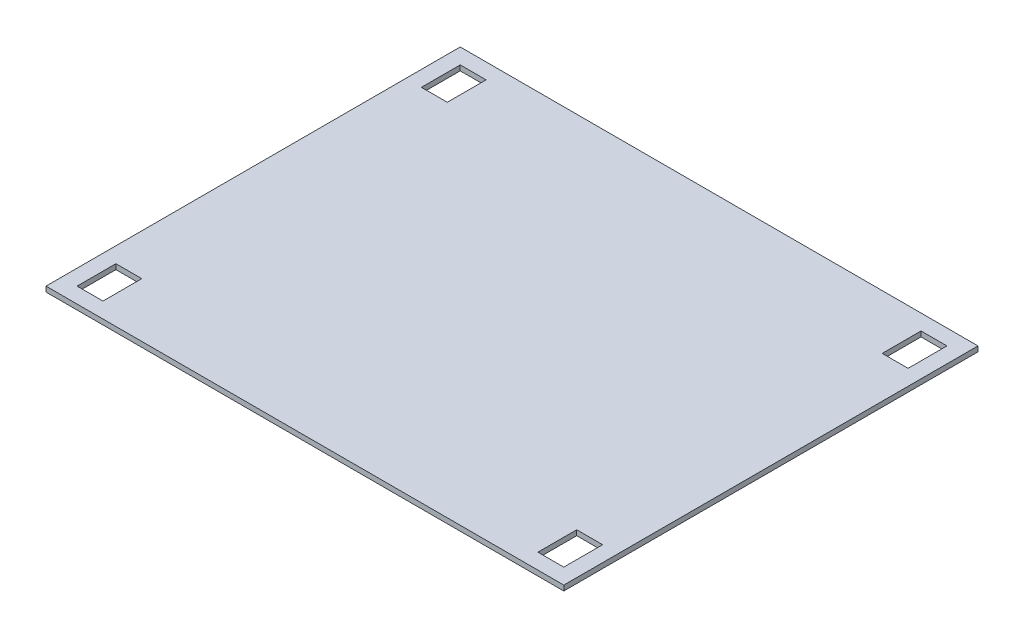
ISO-10303-21;
HEADER;
FILE_DESCRIPTION(('STEP AP214'),'2;1');
FILE_NAME('part.step','',(''),(''),'','','');
FILE_SCHEMA(('AUTOMOTIVE_DESIGN { 1 0 10303 214 1 1 1 1 }'));
ENDSEC;
DATA;
#1=APPLICATION_CONTEXT('core data for automotive mechanical design processes');
#2=APPLICATION_PROTOCOL_DEFINITION('international standard','automotive_design',2000,#1);
#3=PRODUCT_CONTEXT('',#1,'mechanical');
#4=PRODUCT('Part','Part','',(#3));
#5=PRODUCT_RELATED_PRODUCT_CATEGORY('part','',(#4));
#6=PRODUCT_DEFINITION_FORMATION('','',#4);
#7=PRODUCT_DEFINITION_CONTEXT('part definition',#1,'design');
#8=PRODUCT_DEFINITION('design','',#6,#7);
#9=PRODUCT_DEFINITION_SHAPE('','',#8);
#10=(LENGTH_UNIT() NAMED_UNIT(*) SI_UNIT(.MILLI.,.METRE.));
#11=(NAMED_UNIT(*) PLANE_ANGLE_UNIT() SI_UNIT($,.RADIAN.));
#12=(NAMED_UNIT(*) SI_UNIT($,.STERADIAN.) SOLID_ANGLE_UNIT());
#13=UNCERTAINTY_MEASURE_WITH_UNIT(LENGTH_MEASURE(1.E-05),#10,'distance_accuracy_value','');
#14=(GEOMETRIC_REPRESENTATION_CONTEXT(3) GLOBAL_UNCERTAINTY_ASSIGNED_CONTEXT((#13)) GLOBAL_UNIT_ASSIGNED_CONTEXT((#10,
#11,#12)) REPRESENTATION_CONTEXT('',''));
#15=CARTESIAN_POINT('',(0.,0.,0.));
#16=DIRECTION('',(0.,0.,1.));
#17=DIRECTION('',(1.,0.,0.));
#18=AXIS2_PLACEMENT_3D('',#15,#16,#17);
#19=CARTESIAN_POINT('',(-63.5,1.27,-50.8));
#20=DIRECTION('',(1.,0.,0.));
#21=DIRECTION('',(0.,0.,-1.));
#22=AXIS2_PLACEMENT_3D('',#19,#20,#21);
#23=PLANE('',#22);
#24=DIRECTION('',(0.,0.,1.));
#25=VECTOR('',#24,1.);
#26=CARTESIAN_POINT('',(-63.5,0.,-50.8));
#27=LINE('',#26,#25);
#28=CARTESIAN_POINT('',(-63.5,0.,-50.8));
#29=VERTEX_POINT('',#28);
#30=CARTESIAN_POINT('',(-63.5,0.,50.8));
#31=VERTEX_POINT('',#30);
#32=EDGE_CURVE('E356',#29,#31,#27,.T.);
#33=ORIENTED_EDGE('',*,*,#32,.T.);
#34=DIRECTION('',(0.,-1.,0.));
#35=VECTOR('',#34,1.);
#36=CARTESIAN_POINT('',(-63.5,1.27,50.8));
#37=LINE('',#36,#35);
#38=CARTESIAN_POINT('',(-63.5,1.27,50.8));
#39=VERTEX_POINT('',#38);
#40=EDGE_CURVE('E11',#39,#31,#37,.T.);
#41=ORIENTED_EDGE('',*,*,#40,.F.);
#42=DIRECTION('',(0.,0.,1.));
#43=VECTOR('',#42,1.);
#44=CARTESIAN_POINT('',(-63.5,1.27,-50.8));
#45=LINE('',#44,#43);
#46=CARTESIAN_POINT('',(-63.5,1.27,-50.8));
#47=VERTEX_POINT('',#46);
#48=EDGE_CURVE('E357',#47,#39,#45,.T.);
#49=ORIENTED_EDGE('',*,*,#48,.F.);
#50=DIRECTION('',(0.,-1.,0.));
#51=VECTOR('',#50,1.);
#52=CARTESIAN_POINT('',(-63.5,1.27,-50.8));
#53=LINE('',#52,#51);
#54=EDGE_CURVE('E371',#47,#29,#53,.T.);
#55=ORIENTED_EDGE('',*,*,#54,.T.);
#56=EDGE_LOOP('',(#33,#41,#49,#55));
#57=FACE_BOUND('',#56,.T.);
#58=ADVANCED_FACE('F40',(#57),#23,.F.);
#59=CARTESIAN_POINT('',(-63.5,1.27,50.8));
#60=DIRECTION('',(0.,0.,-1.));
#61=DIRECTION('',(-1.,0.,0.));
#62=AXIS2_PLACEMENT_3D('',#59,#60,#61);
#63=PLANE('',#62);
#64=DIRECTION('',(1.,0.,0.));
#65=VECTOR('',#64,1.);
#66=CARTESIAN_POINT('',(-63.5,0.,50.8));
#67=LINE('',#66,#65);
#68=CARTESIAN_POINT('',(63.5,0.,50.8));
#69=VERTEX_POINT('',#68);
#70=EDGE_CURVE('E375',#31,#69,#67,.T.);
#71=ORIENTED_EDGE('',*,*,#70,.T.);
#72=DIRECTION('',(0.,-1.,0.));
#73=VECTOR('',#72,1.);
#74=CARTESIAN_POINT('',(63.5,1.27,50.8));
#75=LINE('',#74,#73);
#76=CARTESIAN_POINT('',(63.5,1.27,50.8));
#77=VERTEX_POINT('',#76);
#78=EDGE_CURVE('E48',#77,#69,#75,.T.);
#79=ORIENTED_EDGE('',*,*,#78,.F.);
#80=DIRECTION('',(1.,0.,0.));
#81=VECTOR('',#80,1.);
#82=CARTESIAN_POINT('',(-63.5,1.27,50.8));
#83=LINE('',#82,#81);
#84=EDGE_CURVE('E361',#39,#77,#83,.T.);
#85=ORIENTED_EDGE('',*,*,#84,.F.);
#86=ORIENTED_EDGE('',*,*,#40,.T.);
#87=EDGE_LOOP('',(#71,#79,#85,#86));
#88=FACE_BOUND('',#87,.T.);
#89=ADVANCED_FACE('F410',(#88),#63,.F.);
#90=CARTESIAN_POINT('',(63.5,1.27,-50.8));
#91=DIRECTION('',(-1.,0.,0.));
#92=DIRECTION('',(0.,0.,1.));
#93=AXIS2_PLACEMENT_3D('',#90,#91,#92);
#94=PLANE('',#93);
#95=DIRECTION('',(0.,0.,-1.));
#96=VECTOR('',#95,1.);
#97=CARTESIAN_POINT('',(63.5,0.,-50.8));
#98=LINE('',#97,#96);
#99=CARTESIAN_POINT('',(63.5,0.,-50.8));
#100=VERTEX_POINT('',#99);
#101=EDGE_CURVE('E378',#69,#100,#98,.T.);
#102=ORIENTED_EDGE('',*,*,#101,.T.);
#103=DIRECTION('',(0.,-1.,0.));
#104=VECTOR('',#103,1.);
#105=CARTESIAN_POINT('',(63.5,1.27,-50.8));
#106=LINE('',#105,#104);
#107=CARTESIAN_POINT('',(63.5,1.27,-50.8));
#108=VERTEX_POINT('',#107);
#109=EDGE_CURVE('E386',#108,#100,#106,.T.);
#110=ORIENTED_EDGE('',*,*,#109,.F.);
#111=DIRECTION('',(0.,0.,-1.));
#112=VECTOR('',#111,1.);
#113=CARTESIAN_POINT('',(63.5,1.27,-50.8));
#114=LINE('',#113,#112);
#115=EDGE_CURVE('E365',#77,#108,#114,.T.);
#116=ORIENTED_EDGE('',*,*,#115,.F.);
#117=ORIENTED_EDGE('',*,*,#78,.T.);
#118=EDGE_LOOP('',(#102,#110,#116,#117));
#119=FACE_BOUND('',#118,.T.);
#120=ADVANCED_FACE('F395',(#119),#94,.F.);
#121=CARTESIAN_POINT('',(-63.5,1.27,-50.8));
#122=DIRECTION('',(0.,0.,1.));
#123=DIRECTION('',(1.,0.,0.));
#124=AXIS2_PLACEMENT_3D('',#121,#122,#123);
#125=PLANE('',#124);
#126=DIRECTION('',(-1.,0.,0.));
#127=VECTOR('',#126,1.);
#128=CARTESIAN_POINT('',(-63.5,0.,-50.8));
#129=LINE('',#128,#127);
#130=EDGE_CURVE('E362',#100,#29,#129,.T.);
#131=ORIENTED_EDGE('',*,*,#130,.T.);
#132=ORIENTED_EDGE('',*,*,#54,.F.);
#133=DIRECTION('',(-1.,0.,0.));
#134=VECTOR('',#133,1.);
#135=CARTESIAN_POINT('',(-63.5,1.27,-50.8));
#136=LINE('',#135,#134);
#137=EDGE_CURVE('E368',#108,#47,#136,.T.);
#138=ORIENTED_EDGE('',*,*,#137,.F.);
#139=ORIENTED_EDGE('',*,*,#109,.T.);
#140=EDGE_LOOP('',(#131,#132,#138,#139));
#141=FACE_BOUND('',#140,.T.);
#142=ADVANCED_FACE('F403',(#141),#125,.F.);
#143=CARTESIAN_POINT('',(0.,1.27,0.));
#144=DIRECTION('',(0.,1.,0.));
#145=DIRECTION('',(0.,0.,1.));
#146=AXIS2_PLACEMENT_3D('',#143,#144,#145);
#147=PLANE('',#146);
#148=DIRECTION('',(1.,0.,0.));
#149=VECTOR('',#148,1.);
#150=CARTESIAN_POINT('',(-59.69,1.27,46.99));
#151=LINE('',#150,#149);
#152=CARTESIAN_POINT('',(-59.69,1.27,46.99));
#153=VERTEX_POINT('',#152);
#154=CARTESIAN_POINT('',(-53.34,1.27,46.99));
#155=VERTEX_POINT('',#154);
#156=EDGE_CURVE('E55',#153,#155,#151,.T.);
#157=ORIENTED_EDGE('',*,*,#156,.F.);
#158=DIRECTION('',(0.,0.,1.));
#159=VECTOR('',#158,1.);
#160=CARTESIAN_POINT('',(-59.69,1.27,46.99));
#161=LINE('',#160,#159);
#162=CARTESIAN_POINT('',(-59.69,1.27,37.465));
#163=VERTEX_POINT('',#162);
#164=EDGE_CURVE('E295',#163,#153,#161,.T.);
#165=ORIENTED_EDGE('',*,*,#164,.F.);
#166=DIRECTION('',(-1.,0.,0.));
#167=VECTOR('',#166,1.);
#168=CARTESIAN_POINT('',(-59.69,1.27,37.465));
#169=LINE('',#168,#167);
#170=CARTESIAN_POINT('',(-53.34,1.27,37.465));
#171=VERTEX_POINT('',#170);
#172=EDGE_CURVE('E291',#171,#163,#169,.T.);
#173=ORIENTED_EDGE('',*,*,#172,.F.);
#174=DIRECTION('',(0.,0.,-1.));
#175=VECTOR('',#174,1.);
#176=CARTESIAN_POINT('',(-53.34,1.27,46.99));
#177=LINE('',#176,#175);
#178=EDGE_CURVE('E287',#155,#171,#177,.T.);
#179=ORIENTED_EDGE('',*,*,#178,.F.);
#180=EDGE_LOOP('',(#157,#165,#173,#179));
#181=FACE_BOUND('',#180,.T.);
#182=DIRECTION('',(0.,0.,-1.));
#183=VECTOR('',#182,1.);
#184=CARTESIAN_POINT('',(59.69,1.27,46.99));
#185=LINE('',#184,#183);
#186=CARTESIAN_POINT('',(59.69,1.27,46.99));
#187=VERTEX_POINT('',#186);
#188=CARTESIAN_POINT('',(59.69,1.27,37.465));
#189=VERTEX_POINT('',#188);
#190=EDGE_CURVE('E63',#187,#189,#185,.T.);
#191=ORIENTED_EDGE('',*,*,#190,.F.);
#192=DIRECTION('',(1.,0.,0.));
#193=VECTOR('',#192,1.);
#194=CARTESIAN_POINT('',(59.69,1.27,46.99));
#195=LINE('',#194,#193);
#196=CARTESIAN_POINT('',(53.34,1.27,46.99));
#197=VERTEX_POINT('',#196);
#198=EDGE_CURVE('E254',#197,#187,#195,.T.);
#199=ORIENTED_EDGE('',*,*,#198,.F.);
#200=DIRECTION('',(0.,0.,1.));
#201=VECTOR('',#200,1.);
#202=CARTESIAN_POINT('',(53.34,1.27,46.99));
#203=LINE('',#202,#201);
#204=CARTESIAN_POINT('',(53.34,1.27,37.465));
#205=VERTEX_POINT('',#204);
#206=EDGE_CURVE('E250',#205,#197,#203,.T.);
#207=ORIENTED_EDGE('',*,*,#206,.F.);
#208=DIRECTION('',(-1.,0.,0.));
#209=VECTOR('',#208,1.);
#210=CARTESIAN_POINT('',(59.69,1.27,37.465));
#211=LINE('',#210,#209);
#212=EDGE_CURVE('E246',#189,#205,#211,.T.);
#213=ORIENTED_EDGE('',*,*,#212,.F.);
#214=EDGE_LOOP('',(#191,#199,#207,#213));
#215=FACE_BOUND('',#214,.T.);
#216=DIRECTION('',(-1.,0.,0.));
#217=VECTOR('',#216,1.);
#218=CARTESIAN_POINT('',(59.69,1.27,-46.99));
#219=LINE('',#218,#217);
#220=CARTESIAN_POINT('',(59.69,1.27,-46.99));
#221=VERTEX_POINT('',#220);
#222=CARTESIAN_POINT('',(53.34,1.27,-46.99));
#223=VERTEX_POINT('',#222);
#224=EDGE_CURVE('E184',#221,#223,#219,.T.);
#225=ORIENTED_EDGE('',*,*,#224,.F.);
#226=DIRECTION('',(0.,0.,-1.));
#227=VECTOR('',#226,1.);
#228=CARTESIAN_POINT('',(59.69,1.27,-46.99));
#229=LINE('',#228,#227);
#230=CARTESIAN_POINT('',(59.69,1.27,-37.465));
#231=VERTEX_POINT('',#230);
#232=EDGE_CURVE('E190',#231,#221,#229,.T.);
#233=ORIENTED_EDGE('',*,*,#232,.F.);
#234=DIRECTION('',(1.,0.,0.));
#235=VECTOR('',#234,1.);
#236=CARTESIAN_POINT('',(59.69,1.27,-37.465));
#237=LINE('',#236,#235);
#238=CARTESIAN_POINT('',(53.34,1.27,-37.465));
#239=VERTEX_POINT('',#238);
#240=EDGE_CURVE('E218',#239,#231,#237,.T.);
#241=ORIENTED_EDGE('',*,*,#240,.F.);
#242=DIRECTION('',(0.,0.,1.));
#243=VECTOR('',#242,1.);
#244=CARTESIAN_POINT('',(53.34,1.27,-46.99));
#245=LINE('',#244,#243);
#246=EDGE_CURVE('E210',#223,#239,#245,.T.);
#247=ORIENTED_EDGE('',*,*,#246,.F.);
#248=EDGE_LOOP('',(#225,#233,#241,#247));
#249=FACE_BOUND('',#248,.T.);
#250=DIRECTION('',(0.,0.,1.));
#251=VECTOR('',#250,1.);
#252=CARTESIAN_POINT('',(-59.69,1.27,-46.99));
#253=LINE('',#252,#251);
#254=CARTESIAN_POINT('',(-59.69,1.27,-46.99));
#255=VERTEX_POINT('',#254);
#256=CARTESIAN_POINT('',(-59.69,1.27,-37.465));
#257=VERTEX_POINT('',#256);
#258=EDGE_CURVE('E324',#255,#257,#253,.T.);
#259=ORIENTED_EDGE('',*,*,#258,.F.);
#260=DIRECTION('',(-1.,0.,0.));
#261=VECTOR('',#260,1.);
#262=CARTESIAN_POINT('',(-59.69,1.27,-46.99));
#263=LINE('',#262,#261);
#264=CARTESIAN_POINT('',(-53.34,1.27,-46.99));
#265=VERTEX_POINT('',#264);
#266=EDGE_CURVE('E335',#265,#255,#263,.T.);
#267=ORIENTED_EDGE('',*,*,#266,.F.);
#268=DIRECTION('',(0.,0.,-1.));
#269=VECTOR('',#268,1.);
#270=CARTESIAN_POINT('',(-53.34,1.27,-46.99));
#271=LINE('',#270,#269);
#272=CARTESIAN_POINT('',(-53.34,1.27,-37.465));
#273=VERTEX_POINT('',#272);
#274=EDGE_CURVE('E331',#273,#265,#271,.T.);
#275=ORIENTED_EDGE('',*,*,#274,.F.);
#276=DIRECTION('',(1.,0.,0.));
#277=VECTOR('',#276,1.);
#278=CARTESIAN_POINT('',(-59.69,1.27,-37.465));
#279=LINE('',#278,#277);
#280=EDGE_CURVE('E327',#257,#273,#279,.T.);
#281=ORIENTED_EDGE('',*,*,#280,.F.);
#282=EDGE_LOOP('',(#259,#267,#275,#281));
#283=FACE_BOUND('',#282,.T.);
#284=ORIENTED_EDGE('',*,*,#48,.T.);
#285=ORIENTED_EDGE('',*,*,#84,.T.);
#286=ORIENTED_EDGE('',*,*,#115,.T.);
#287=ORIENTED_EDGE('',*,*,#137,.T.);
#288=EDGE_LOOP('',(#284,#285,#286,#287));
#289=FACE_BOUND('',#288,.T.);
#290=ADVANCED_FACE('F409',(#181,#215,#249,#283,#289),#147,.T.);
#291=CARTESIAN_POINT('',(0.,0.,0.));
#292=DIRECTION('',(0.,1.,0.));
#293=DIRECTION('',(0.,0.,1.));
#294=AXIS2_PLACEMENT_3D('',#291,#292,#293);
#295=PLANE('',#294);
#296=DIRECTION('',(0.,0.,-1.));
#297=VECTOR('',#296,1.);
#298=CARTESIAN_POINT('',(-59.69,0.,46.99));
#299=LINE('',#298,#297);
#300=CARTESIAN_POINT('',(-59.69,0.,46.99));
#301=VERTEX_POINT('',#300);
#302=CARTESIAN_POINT('',(-59.69,0.,37.465));
#303=VERTEX_POINT('',#302);
#304=EDGE_CURVE('E277',#301,#303,#299,.T.);
#305=ORIENTED_EDGE('',*,*,#304,.F.);
#306=DIRECTION('',(-1.,0.,0.));
#307=VECTOR('',#306,1.);
#308=CARTESIAN_POINT('',(-59.69,0.,46.99));
#309=LINE('',#308,#307);
#310=CARTESIAN_POINT('',(-53.34,0.,46.99));
#311=VERTEX_POINT('',#310);
#312=EDGE_CURVE('E281',#311,#301,#309,.T.);
#313=ORIENTED_EDGE('',*,*,#312,.F.);
#314=DIRECTION('',(0.,0.,1.));
#315=VECTOR('',#314,1.);
#316=CARTESIAN_POINT('',(-53.34,0.,46.99));
#317=LINE('',#316,#315);
#318=CARTESIAN_POINT('',(-53.34,0.,37.465));
#319=VERTEX_POINT('',#318);
#320=EDGE_CURVE('E236',#319,#311,#317,.T.);
#321=ORIENTED_EDGE('',*,*,#320,.F.);
#322=DIRECTION('',(1.,0.,0.));
#323=VECTOR('',#322,1.);
#324=CARTESIAN_POINT('',(-59.69,0.,37.465));
#325=LINE('',#324,#323);
#326=EDGE_CURVE('E274',#303,#319,#325,.T.);
#327=ORIENTED_EDGE('',*,*,#326,.F.);
#328=EDGE_LOOP('',(#305,#313,#321,#327));
#329=FACE_BOUND('',#328,.T.);
#330=DIRECTION('',(-1.,0.,0.));
#331=VECTOR('',#330,1.);
#332=CARTESIAN_POINT('',(59.69,0.,46.99));
#333=LINE('',#332,#331);
#334=CARTESIAN_POINT('',(59.69,0.,46.99));
#335=VERTEX_POINT('',#334);
#336=CARTESIAN_POINT('',(53.34,0.,46.99));
#337=VERTEX_POINT('',#336);
#338=EDGE_CURVE('E235',#335,#337,#333,.T.);
#339=ORIENTED_EDGE('',*,*,#338,.F.);
#340=DIRECTION('',(0.,0.,1.));
#341=VECTOR('',#340,1.);
#342=CARTESIAN_POINT('',(59.69,0.,46.99));
#343=LINE('',#342,#341);
#344=CARTESIAN_POINT('',(59.69,0.,37.465));
#345=VERTEX_POINT('',#344);
#346=EDGE_CURVE('E240',#345,#335,#343,.T.);
#347=ORIENTED_EDGE('',*,*,#346,.F.);
#348=DIRECTION('',(1.,0.,0.));
#349=VECTOR('',#348,1.);
#350=CARTESIAN_POINT('',(59.69,0.,37.465));
#351=LINE('',#350,#349);
#352=CARTESIAN_POINT('',(53.34,0.,37.465));
#353=VERTEX_POINT('',#352);
#354=EDGE_CURVE('E262',#353,#345,#351,.T.);
#355=ORIENTED_EDGE('',*,*,#354,.F.);
#356=DIRECTION('',(0.,0.,-1.));
#357=VECTOR('',#356,1.);
#358=CARTESIAN_POINT('',(53.34,0.,46.99));
#359=LINE('',#358,#357);
#360=EDGE_CURVE('E232',#337,#353,#359,.T.);
#361=ORIENTED_EDGE('',*,*,#360,.F.);
#362=EDGE_LOOP('',(#339,#347,#355,#361));
#363=FACE_BOUND('',#362,.T.);
#364=DIRECTION('',(0.,0.,1.));
#365=VECTOR('',#364,1.);
#366=CARTESIAN_POINT('',(59.69,0.,-46.99));
#367=LINE('',#366,#365);
#368=CARTESIAN_POINT('',(59.69,0.,-46.99));
#369=VERTEX_POINT('',#368);
#370=CARTESIAN_POINT('',(59.69,0.,-37.465));
#371=VERTEX_POINT('',#370);
#372=EDGE_CURVE('E205',#369,#371,#367,.T.);
#373=ORIENTED_EDGE('',*,*,#372,.F.);
#374=DIRECTION('',(1.,0.,0.));
#375=VECTOR('',#374,1.);
#376=CARTESIAN_POINT('',(59.69,0.,-46.99));
#377=LINE('',#376,#375);
#378=CARTESIAN_POINT('',(53.34,0.,-46.99));
#379=VERTEX_POINT('',#378);
#380=EDGE_CURVE('E181',#379,#369,#377,.T.);
#381=ORIENTED_EDGE('',*,*,#380,.F.);
#382=DIRECTION('',(0.,0.,-1.));
#383=VECTOR('',#382,1.);
#384=CARTESIAN_POINT('',(53.34,0.,-46.99));
#385=LINE('',#384,#383);
#386=CARTESIAN_POINT('',(53.34,0.,-37.465));
#387=VERTEX_POINT('',#386);
#388=EDGE_CURVE('E194',#387,#379,#385,.T.);
#389=ORIENTED_EDGE('',*,*,#388,.F.);
#390=DIRECTION('',(-1.,0.,0.));
#391=VECTOR('',#390,1.);
#392=CARTESIAN_POINT('',(59.69,0.,-37.465));
#393=LINE('',#392,#391);
#394=EDGE_CURVE('E212',#371,#387,#393,.T.);
#395=ORIENTED_EDGE('',*,*,#394,.F.);
#396=EDGE_LOOP('',(#373,#381,#389,#395));
#397=FACE_BOUND('',#396,.T.);
#398=DIRECTION('',(1.,0.,0.));
#399=VECTOR('',#398,1.);
#400=CARTESIAN_POINT('',(-59.69,0.,-46.99));
#401=LINE('',#400,#399);
#402=CARTESIAN_POINT('',(-59.69,0.,-46.99));
#403=VERTEX_POINT('',#402);
#404=CARTESIAN_POINT('',(-53.34,0.,-46.99));
#405=VERTEX_POINT('',#404);
#406=EDGE_CURVE('E316',#403,#405,#401,.T.);
#407=ORIENTED_EDGE('',*,*,#406,.F.);
#408=DIRECTION('',(0.,0.,-1.));
#409=VECTOR('',#408,1.);
#410=CARTESIAN_POINT('',(-59.69,0.,-46.99));
#411=LINE('',#410,#409);
#412=CARTESIAN_POINT('',(-59.69,0.,-37.465));
#413=VERTEX_POINT('',#412);
#414=EDGE_CURVE('E320',#413,#403,#411,.T.);
#415=ORIENTED_EDGE('',*,*,#414,.F.);
#416=DIRECTION('',(-1.,0.,0.));
#417=VECTOR('',#416,1.);
#418=CARTESIAN_POINT('',(-59.69,0.,-37.465));
#419=LINE('',#418,#417);
#420=CARTESIAN_POINT('',(-53.34,0.,-37.465));
#421=VERTEX_POINT('',#420);
#422=EDGE_CURVE('E343',#421,#413,#419,.T.);
#423=ORIENTED_EDGE('',*,*,#422,.F.);
#424=DIRECTION('',(0.,0.,1.));
#425=VECTOR('',#424,1.);
#426=CARTESIAN_POINT('',(-53.34,0.,-46.99));
#427=LINE('',#426,#425);
#428=EDGE_CURVE('E199',#405,#421,#427,.T.);
#429=ORIENTED_EDGE('',*,*,#428,.F.);
#430=EDGE_LOOP('',(#407,#415,#423,#429));
#431=FACE_BOUND('',#430,.T.);
#432=ORIENTED_EDGE('',*,*,#32,.F.);
#433=ORIENTED_EDGE('',*,*,#130,.F.);
#434=ORIENTED_EDGE('',*,*,#101,.F.);
#435=ORIENTED_EDGE('',*,*,#70,.F.);
#436=EDGE_LOOP('',(#432,#433,#434,#435));
#437=FACE_BOUND('',#436,.T.);
#438=ADVANCED_FACE('F202',(#329,#363,#397,#431,#437),#295,.F.);
#439=CARTESIAN_POINT('',(-59.69,-0.000999999999999916,-46.99));
#440=DIRECTION('',(-1.,0.,0.));
#441=DIRECTION('',(0.,0.,1.));
#442=AXIS2_PLACEMENT_3D('',#439,#440,#441);
#443=PLANE('',#442);
#444=ORIENTED_EDGE('',*,*,#414,.T.);
#445=DIRECTION('',(0.,1.,0.));
#446=VECTOR('',#445,1.);
#447=CARTESIAN_POINT('',(-59.69,-0.000999999999999916,-46.99));
#448=LINE('',#447,#446);
#449=EDGE_CURVE('E340',#403,#255,#448,.T.);
#450=ORIENTED_EDGE('',*,*,#449,.T.);
#451=ORIENTED_EDGE('',*,*,#258,.T.);
#452=DIRECTION('',(0.,1.,0.));
#453=VECTOR('',#452,1.);
#454=CARTESIAN_POINT('',(-59.69,-0.000999999999999916,-37.465));
#455=LINE('',#454,#453);
#456=EDGE_CURVE('E339',#413,#257,#455,.T.);
#457=ORIENTED_EDGE('',*,*,#456,.F.);
#458=EDGE_LOOP('',(#444,#450,#451,#457));
#459=FACE_BOUND('',#458,.T.);
#460=ADVANCED_FACE('F422',(#459),#443,.F.);
#461=CARTESIAN_POINT('',(-59.69,-0.000999999999999916,-46.99));
#462=DIRECTION('',(0.,0.,-1.));
#463=DIRECTION('',(-1.,0.,0.));
#464=AXIS2_PLACEMENT_3D('',#461,#462,#463);
#465=PLANE('',#464);
#466=ORIENTED_EDGE('',*,*,#406,.T.);
#467=DIRECTION('',(0.,1.,0.));
#468=VECTOR('',#467,1.);
#469=CARTESIAN_POINT('',(-53.34,-0.000999999999999916,-46.99));
#470=LINE('',#469,#468);
#471=EDGE_CURVE('E344',#405,#265,#470,.T.);
#472=ORIENTED_EDGE('',*,*,#471,.T.);
#473=ORIENTED_EDGE('',*,*,#266,.T.);
#474=ORIENTED_EDGE('',*,*,#449,.F.);
#475=EDGE_LOOP('',(#466,#472,#473,#474));
#476=FACE_BOUND('',#475,.T.);
#477=ADVANCED_FACE('F429',(#476),#465,.F.);
#478=CARTESIAN_POINT('',(-53.34,-0.000999999999999916,-46.99));
#479=DIRECTION('',(1.,0.,0.));
#480=DIRECTION('',(0.,0.,-1.));
#481=AXIS2_PLACEMENT_3D('',#478,#479,#480);
#482=PLANE('',#481);
#483=ORIENTED_EDGE('',*,*,#428,.T.);
#484=DIRECTION('',(0.,1.,0.));
#485=VECTOR('',#484,1.);
#486=CARTESIAN_POINT('',(-53.34,-0.000999999999999916,-37.465));
#487=LINE('',#486,#485);
#488=EDGE_CURVE('E347',#421,#273,#487,.T.);
#489=ORIENTED_EDGE('',*,*,#488,.T.);
#490=ORIENTED_EDGE('',*,*,#274,.T.);
#491=ORIENTED_EDGE('',*,*,#471,.F.);
#492=EDGE_LOOP('',(#483,#489,#490,#491));
#493=FACE_BOUND('',#492,.T.);
#494=ADVANCED_FACE('F434',(#493),#482,.F.);
#495=CARTESIAN_POINT('',(-59.69,-0.000999999999999916,-37.465));
#496=DIRECTION('',(0.,0.,1.));
#497=DIRECTION('',(1.,0.,0.));
#498=AXIS2_PLACEMENT_3D('',#495,#496,#497);
#499=PLANE('',#498);
#500=ORIENTED_EDGE('',*,*,#422,.T.);
#501=ORIENTED_EDGE('',*,*,#456,.T.);
#502=ORIENTED_EDGE('',*,*,#280,.T.);
#503=ORIENTED_EDGE('',*,*,#488,.F.);
#504=EDGE_LOOP('',(#500,#501,#502,#503));
#505=FACE_BOUND('',#504,.T.);
#506=ADVANCED_FACE('F431',(#505),#499,.F.);
#507=CARTESIAN_POINT('',(59.69,-0.000999999999999916,-46.99));
#508=DIRECTION('',(0.,0.,-1.));
#509=DIRECTION('',(-1.,0.,0.));
#510=AXIS2_PLACEMENT_3D('',#507,#508,#509);
#511=PLANE('',#510);
#512=ORIENTED_EDGE('',*,*,#380,.T.);
#513=DIRECTION('',(0.,1.,0.));
#514=VECTOR('',#513,1.);
#515=CARTESIAN_POINT('',(59.69,-0.000999999999999916,-46.99));
#516=LINE('',#515,#514);
#517=EDGE_CURVE('E200',#369,#221,#516,.T.);
#518=ORIENTED_EDGE('',*,*,#517,.T.);
#519=ORIENTED_EDGE('',*,*,#224,.T.);
#520=DIRECTION('',(0.,1.,0.));
#521=VECTOR('',#520,1.);
#522=CARTESIAN_POINT('',(53.34,-0.000999999999999916,-46.99));
#523=LINE('',#522,#521);
#524=EDGE_CURVE('E177',#379,#223,#523,.T.);
#525=ORIENTED_EDGE('',*,*,#524,.F.);
#526=EDGE_LOOP('',(#512,#518,#519,#525));
#527=FACE_BOUND('',#526,.T.);
#528=ADVANCED_FACE('F179',(#527),#511,.F.);
#529=CARTESIAN_POINT('',(59.69,-0.000999999999999916,-46.99));
#530=DIRECTION('',(1.,0.,0.));
#531=DIRECTION('',(0.,0.,-1.));
#532=AXIS2_PLACEMENT_3D('',#529,#530,#531);
#533=PLANE('',#532);
#534=ORIENTED_EDGE('',*,*,#372,.T.);
#535=DIRECTION('',(0.,1.,0.));
#536=VECTOR('',#535,1.);
#537=CARTESIAN_POINT('',(59.69,-0.000999999999999916,-37.465));
#538=LINE('',#537,#536);
#539=EDGE_CURVE('E227',#371,#231,#538,.T.);
#540=ORIENTED_EDGE('',*,*,#539,.T.);
#541=ORIENTED_EDGE('',*,*,#232,.T.);
#542=ORIENTED_EDGE('',*,*,#517,.F.);
#543=EDGE_LOOP('',(#534,#540,#541,#542));
#544=FACE_BOUND('',#543,.T.);
#545=ADVANCED_FACE('F474',(#544),#533,.F.);
#546=CARTESIAN_POINT('',(59.69,-0.000999999999999916,-37.465));
#547=DIRECTION('',(0.,0.,1.));
#548=DIRECTION('',(1.,0.,0.));
#549=AXIS2_PLACEMENT_3D('',#546,#547,#548);
#550=PLANE('',#549);
#551=ORIENTED_EDGE('',*,*,#394,.T.);
#552=DIRECTION('',(0.,1.,0.));
#553=VECTOR('',#552,1.);
#554=CARTESIAN_POINT('',(53.34,-0.000999999999999916,-37.465));
#555=LINE('',#554,#553);
#556=EDGE_CURVE('E189',#387,#239,#555,.T.);
#557=ORIENTED_EDGE('',*,*,#556,.T.);
#558=ORIENTED_EDGE('',*,*,#240,.T.);
#559=ORIENTED_EDGE('',*,*,#539,.F.);
#560=EDGE_LOOP('',(#551,#557,#558,#559));
#561=FACE_BOUND('',#560,.T.);
#562=ADVANCED_FACE('F477',(#561),#550,.F.);
#563=CARTESIAN_POINT('',(53.34,-0.000999999999999916,-46.99));
#564=DIRECTION('',(-1.,0.,0.));
#565=DIRECTION('',(0.,0.,1.));
#566=AXIS2_PLACEMENT_3D('',#563,#564,#565);
#567=PLANE('',#566);
#568=ORIENTED_EDGE('',*,*,#388,.T.);
#569=ORIENTED_EDGE('',*,*,#524,.T.);
#570=ORIENTED_EDGE('',*,*,#246,.T.);
#571=ORIENTED_EDGE('',*,*,#556,.F.);
#572=EDGE_LOOP('',(#568,#569,#570,#571));
#573=FACE_BOUND('',#572,.T.);
#574=ADVANCED_FACE('F195',(#573),#567,.F.);
#575=CARTESIAN_POINT('',(59.69,-0.000999999999999916,46.99));
#576=DIRECTION('',(1.,0.,0.));
#577=DIRECTION('',(0.,0.,-1.));
#578=AXIS2_PLACEMENT_3D('',#575,#576,#577);
#579=PLANE('',#578);
#580=ORIENTED_EDGE('',*,*,#346,.T.);
#581=DIRECTION('',(0.,1.,0.));
#582=VECTOR('',#581,1.);
#583=CARTESIAN_POINT('',(59.69,-0.000999999999999916,46.99));
#584=LINE('',#583,#582);
#585=EDGE_CURVE('E259',#335,#187,#584,.T.);
#586=ORIENTED_EDGE('',*,*,#585,.T.);
#587=ORIENTED_EDGE('',*,*,#190,.T.);
#588=DIRECTION('',(0.,1.,0.));
#589=VECTOR('',#588,1.);
#590=CARTESIAN_POINT('',(59.69,-0.000999999999999916,37.465));
#591=LINE('',#590,#589);
#592=EDGE_CURVE('E258',#345,#189,#591,.T.);
#593=ORIENTED_EDGE('',*,*,#592,.F.);
#594=EDGE_LOOP('',(#580,#586,#587,#593));
#595=FACE_BOUND('',#594,.T.);
#596=ADVANCED_FACE('F458',(#595),#579,.F.);
#597=CARTESIAN_POINT('',(59.69,-0.000999999999999916,46.99));
#598=DIRECTION('',(0.,0.,1.));
#599=DIRECTION('',(1.,0.,0.));
#600=AXIS2_PLACEMENT_3D('',#597,#598,#599);
#601=PLANE('',#600);
#602=ORIENTED_EDGE('',*,*,#338,.T.);
#603=DIRECTION('',(0.,1.,0.));
#604=VECTOR('',#603,1.);
#605=CARTESIAN_POINT('',(53.34,-0.000999999999999916,46.99));
#606=LINE('',#605,#604);
#607=EDGE_CURVE('E263',#337,#197,#606,.T.);
#608=ORIENTED_EDGE('',*,*,#607,.T.);
#609=ORIENTED_EDGE('',*,*,#198,.T.);
#610=ORIENTED_EDGE('',*,*,#585,.F.);
#611=EDGE_LOOP('',(#602,#608,#609,#610));
#612=FACE_BOUND('',#611,.T.);
#613=ADVANCED_FACE('F461',(#612),#601,.F.);
#614=CARTESIAN_POINT('',(53.34,-0.000999999999999916,46.99));
#615=DIRECTION('',(-1.,0.,0.));
#616=DIRECTION('',(0.,0.,1.));
#617=AXIS2_PLACEMENT_3D('',#614,#615,#616);
#618=PLANE('',#617);
#619=ORIENTED_EDGE('',*,*,#360,.T.);
#620=DIRECTION('',(0.,1.,0.));
#621=VECTOR('',#620,1.);
#622=CARTESIAN_POINT('',(53.34,-0.000999999999999916,37.465));
#623=LINE('',#622,#621);
#624=EDGE_CURVE('E266',#353,#205,#623,.T.);
#625=ORIENTED_EDGE('',*,*,#624,.T.);
#626=ORIENTED_EDGE('',*,*,#206,.T.);
#627=ORIENTED_EDGE('',*,*,#607,.F.);
#628=EDGE_LOOP('',(#619,#625,#626,#627));
#629=FACE_BOUND('',#628,.T.);
#630=ADVANCED_FACE('F464',(#629),#618,.F.);
#631=CARTESIAN_POINT('',(59.69,-0.000999999999999916,37.465));
#632=DIRECTION('',(0.,0.,-1.));
#633=DIRECTION('',(-1.,0.,0.));
#634=AXIS2_PLACEMENT_3D('',#631,#632,#633);
#635=PLANE('',#634);
#636=ORIENTED_EDGE('',*,*,#354,.T.);
#637=ORIENTED_EDGE('',*,*,#592,.T.);
#638=ORIENTED_EDGE('',*,*,#212,.T.);
#639=ORIENTED_EDGE('',*,*,#624,.F.);
#640=EDGE_LOOP('',(#636,#637,#638,#639));
#641=FACE_BOUND('',#640,.T.);
#642=ADVANCED_FACE('F446',(#641),#635,.F.);
#643=CARTESIAN_POINT('',(-59.69,-0.000999999999999916,46.99));
#644=DIRECTION('',(0.,0.,1.));
#645=DIRECTION('',(1.,0.,0.));
#646=AXIS2_PLACEMENT_3D('',#643,#644,#645);
#647=PLANE('',#646);
#648=ORIENTED_EDGE('',*,*,#312,.T.);
#649=DIRECTION('',(0.,1.,0.));
#650=VECTOR('',#649,1.);
#651=CARTESIAN_POINT('',(-59.69,-0.000999999999999916,46.99));
#652=LINE('',#651,#650);
#653=EDGE_CURVE('E300',#301,#153,#652,.T.);
#654=ORIENTED_EDGE('',*,*,#653,.T.);
#655=ORIENTED_EDGE('',*,*,#156,.T.);
#656=DIRECTION('',(0.,1.,0.));
#657=VECTOR('',#656,1.);
#658=CARTESIAN_POINT('',(-53.34,-0.000999999999999916,46.99));
#659=LINE('',#658,#657);
#660=EDGE_CURVE('E299',#311,#155,#659,.T.);
#661=ORIENTED_EDGE('',*,*,#660,.F.);
#662=EDGE_LOOP('',(#648,#654,#655,#661));
#663=FACE_BOUND('',#662,.T.);
#664=ADVANCED_FACE('F442',(#663),#647,.F.);
#665=CARTESIAN_POINT('',(-59.69,-0.000999999999999916,46.99));
#666=DIRECTION('',(-1.,0.,0.));
#667=DIRECTION('',(0.,0.,1.));
#668=AXIS2_PLACEMENT_3D('',#665,#666,#667);
#669=PLANE('',#668);
#670=ORIENTED_EDGE('',*,*,#304,.T.);
#671=DIRECTION('',(0.,1.,0.));
#672=VECTOR('',#671,1.);
#673=CARTESIAN_POINT('',(-59.69,-0.000999999999999916,37.465));
#674=LINE('',#673,#672);
#675=EDGE_CURVE('E303',#303,#163,#674,.T.);
#676=ORIENTED_EDGE('',*,*,#675,.T.);
#677=ORIENTED_EDGE('',*,*,#164,.T.);
#678=ORIENTED_EDGE('',*,*,#653,.F.);
#679=EDGE_LOOP('',(#670,#676,#677,#678));
#680=FACE_BOUND('',#679,.T.);
#681=ADVANCED_FACE('F445',(#680),#669,.F.);
#682=CARTESIAN_POINT('',(-59.69,-0.000999999999999916,37.465));
#683=DIRECTION('',(0.,0.,-1.));
#684=DIRECTION('',(-1.,0.,0.));
#685=AXIS2_PLACEMENT_3D('',#682,#683,#684);
#686=PLANE('',#685);
#687=ORIENTED_EDGE('',*,*,#326,.T.);
#688=DIRECTION('',(0.,1.,0.));
#689=VECTOR('',#688,1.);
#690=CARTESIAN_POINT('',(-53.34,-0.000999999999999916,37.465));
#691=LINE('',#690,#689);
#692=EDGE_CURVE('E306',#319,#171,#691,.T.);
#693=ORIENTED_EDGE('',*,*,#692,.T.);
#694=ORIENTED_EDGE('',*,*,#172,.T.);
#695=ORIENTED_EDGE('',*,*,#675,.F.);
#696=EDGE_LOOP('',(#687,#693,#694,#695));
#697=FACE_BOUND('',#696,.T.);
#698=ADVANCED_FACE('F450',(#697),#686,.F.);
#699=CARTESIAN_POINT('',(-53.34,-0.000999999999999916,46.99));
#700=DIRECTION('',(1.,0.,0.));
#701=DIRECTION('',(0.,0.,-1.));
#702=AXIS2_PLACEMENT_3D('',#699,#700,#701);
#703=PLANE('',#702);
#704=ORIENTED_EDGE('',*,*,#320,.T.);
#705=ORIENTED_EDGE('',*,*,#660,.T.);
#706=ORIENTED_EDGE('',*,*,#178,.T.);
#707=ORIENTED_EDGE('',*,*,#692,.F.);
#708=EDGE_LOOP('',(#704,#705,#706,#707));
#709=FACE_BOUND('',#708,.T.);
#710=ADVANCED_FACE('F447',(#709),#703,.F.);
#711=CLOSED_SHELL('',(#58,#89,#120,#142,#290,#438,#460,#477,#494,#506,#528,#545,#562,#574,#596,
#613,#630,#642,#664,#681,#698,#710));
#712=MANIFOLD_SOLID_BREP('B2',#711);
#713=ADVANCED_BREP_SHAPE_REPRESENTATION('',(#18,#712),#14);
#714=SHAPE_DEFINITION_REPRESENTATION(#9,#713);
ENDSEC;
END-ISO-10303-21;
